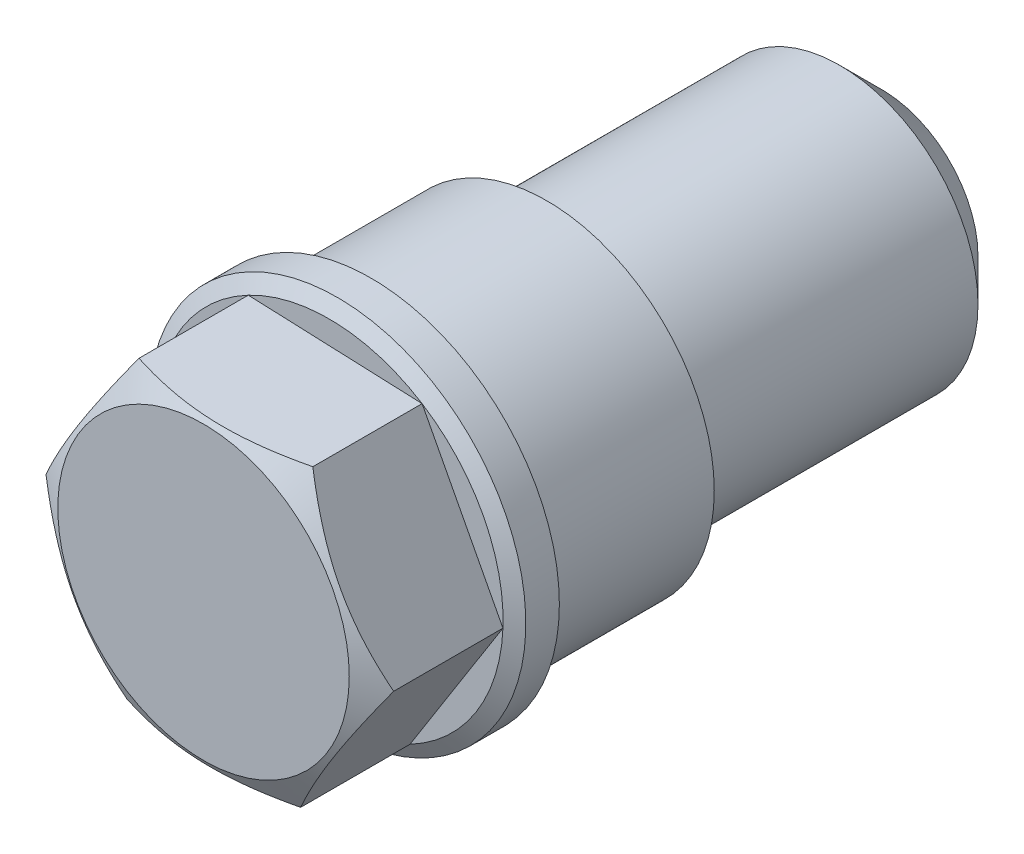
ISO-10303-21;
HEADER;
FILE_DESCRIPTION(('STEP AP214'),'2;1');
FILE_NAME('part.step','',(''),(''),'','','');
FILE_SCHEMA(('AUTOMOTIVE_DESIGN { 1 0 10303 214 1 1 1 1 }'));
ENDSEC;
DATA;
#1=APPLICATION_CONTEXT('core data for automotive mechanical design processes');
#2=APPLICATION_PROTOCOL_DEFINITION('international standard','automotive_design',2000,#1);
#3=PRODUCT_CONTEXT('',#1,'mechanical');
#4=PRODUCT('Part','Part','',(#3));
#5=PRODUCT_RELATED_PRODUCT_CATEGORY('part','',(#4));
#6=PRODUCT_DEFINITION_FORMATION('','',#4);
#7=PRODUCT_DEFINITION_CONTEXT('part definition',#1,'design');
#8=PRODUCT_DEFINITION('design','',#6,#7);
#9=PRODUCT_DEFINITION_SHAPE('','',#8);
#10=(LENGTH_UNIT() NAMED_UNIT(*) SI_UNIT(.MILLI.,.METRE.));
#11=(NAMED_UNIT(*) PLANE_ANGLE_UNIT() SI_UNIT($,.RADIAN.));
#12=(NAMED_UNIT(*) SI_UNIT($,.STERADIAN.) SOLID_ANGLE_UNIT());
#13=UNCERTAINTY_MEASURE_WITH_UNIT(LENGTH_MEASURE(1.E-05),#10,'distance_accuracy_value','');
#14=(GEOMETRIC_REPRESENTATION_CONTEXT(3) GLOBAL_UNCERTAINTY_ASSIGNED_CONTEXT((#13)) GLOBAL_UNIT_ASSIGNED_CONTEXT((#10,
#11,#12)) REPRESENTATION_CONTEXT('',''));
#15=CARTESIAN_POINT('',(0.,0.,0.));
#16=DIRECTION('',(0.,0.,1.));
#17=DIRECTION('',(1.,0.,0.));
#18=AXIS2_PLACEMENT_3D('',#15,#16,#17);
#19=CARTESIAN_POINT('',(-1.93101930562752,3.67967126065155,16.2));
#20=DIRECTION('',(0.845164899322667,-0.534505652872732,0.));
#21=DIRECTION('',(0.534505652872732,0.845164899322667,0.));
#22=AXIS2_PLACEMENT_3D('',#19,#20,#21);
#23=PLANE('',#22);
#24=CARTESIAN_POINT('',(-1.93089282009711,3.67987126065155,15.8105225637109));
#25=CARTESIAN_POINT('',(-2.02850232577983,3.52553027735251,15.8632591209234));
#26=CARTESIAN_POINT('',(-2.12695439061747,3.36985703232806,15.9112211166116));
#27=CARTESIAN_POINT('',(-2.32556332593779,3.05581488904591,15.994939306388));
#28=CARTESIAN_POINT('',(-2.42572372545706,2.89744041064543,16.0306658839842));
#29=CARTESIAN_POINT('',(-2.62480322277564,2.58265421071628,16.0862795686884));
#30=CARTESIAN_POINT('',(-2.72369168953103,2.42629092325561,16.1065368132222));
#31=CARTESIAN_POINT('',(-2.92193393408525,2.11282859454182,16.1307198650165));
#32=CARTESIAN_POINT('',(-3.02128699131302,1.95573069266181,16.1346656978121));
#33=CARTESIAN_POINT('',(-3.20693419191941,1.66218375491334,16.1264575898091));
#34=CARTESIAN_POINT('',(-3.29325612405091,1.52569077923171,16.1163190181107));
#35=CARTESIAN_POINT('',(-3.46533760072212,1.25359407992749,16.0841855129931));
#36=CARTESIAN_POINT('',(-3.55109655005232,1.11799129745525,16.0621796023997));
#37=CARTESIAN_POINT('',(-3.72353283458237,0.845333572937014,16.007166455926));
#38=CARTESIAN_POINT('',(-3.81018834488149,0.708313140610283,15.9739260178288));
#39=CARTESIAN_POINT('',(-3.98220690796934,0.436315920800911,15.8984832671009));
#40=CARTESIAN_POINT('',(-4.06757216462375,0.301335648547065,15.85629868128));
#41=CARTESIAN_POINT('',(-4.15232492764392,0.167323856454169,15.8105225637109));
#42=B_SPLINE_CURVE_WITH_KNOTS('',3,(#24,#25,#26,#27,#28,#29,#30,#31,#32,#33,#34,#35,#36,#37,#38,
#39,#40,#41),.UNSPECIFIED.,.F.,.F.,(4,2,2,2,2,2,2,2,4),(0.,0.570460334434682,1.14229189781938,
1.69997082129559,2.25696487814101,2.74195302123139,3.22739054508561,3.72359597787217,
4.21882700126054),.UNSPECIFIED.);
#43=CARTESIAN_POINT('',(-1.93101930562752,3.67967126065155,15.8105908787731));
#44=VERTEX_POINT('',#43);
#45=CARTESIAN_POINT('',(-4.15219844211351,0.167523856454169,15.8105908787731));
#46=VERTEX_POINT('',#45);
#47=EDGE_CURVE('E105',#44,#46,#42,.T.);
#48=ORIENTED_EDGE('',*,*,#47,.F.);
#49=DIRECTION('',(0.,0.,-1.));
#50=VECTOR('',#49,1.);
#51=CARTESIAN_POINT('',(-1.93101930562752,3.67967126065155,16.2));
#52=LINE('',#51,#50);
#53=CARTESIAN_POINT('',(-1.93101930562749,3.67967126065155,13.2));
#54=VERTEX_POINT('',#53);
#55=EDGE_CURVE('E116',#44,#54,#52,.T.);
#56=ORIENTED_EDGE('',*,*,#55,.T.);
#57=DIRECTION('',(-0.534505652872732,-0.845164899322668,0.));
#58=VECTOR('',#57,1.);
#59=CARTESIAN_POINT('',(-1.93101930562752,3.67967126065155,13.2));
#60=LINE('',#59,#58);
#61=CARTESIAN_POINT('',(-4.1521984421135,0.167523856454147,13.2));
#62=VERTEX_POINT('',#61);
#63=EDGE_CURVE('E120',#54,#62,#60,.T.);
#64=ORIENTED_EDGE('',*,*,#63,.T.);
#65=DIRECTION('',(0.,0.,-1.));
#66=VECTOR('',#65,1.);
#67=CARTESIAN_POINT('',(-4.15219844211351,0.167523856454169,16.2));
#68=LINE('',#67,#66);
#69=EDGE_CURVE('E118',#46,#62,#68,.T.);
#70=ORIENTED_EDGE('',*,*,#69,.F.);
#71=EDGE_LOOP('',(#48,#56,#64,#70));
#72=FACE_BOUND('',#71,.T.);
#73=ADVANCED_FACE('F49',(#72),#23,.F.);
#74=CARTESIAN_POINT('',(-4.15219844211351,0.167523856454169,16.2));
#75=DIRECTION('',(0.885477923515507,0.464681446763981,0.));
#76=DIRECTION('',(-0.464681446763981,0.885477923515507,0.));
#77=AXIS2_PLACEMENT_3D('',#74,#75,#76);
#78=PLANE('',#77);
#79=CARTESIAN_POINT('',(-4.15230339819077,0.167723856454169,15.8105256740075));
#80=CARTESIAN_POINT('',(-4.06744502313959,0.00602121423229818,15.8632619757784));
#81=CARTESIAN_POINT('',(-3.98185415570975,-0.157077235450731,15.911223700143));
#82=CARTESIAN_POINT('',(-3.80919032785132,-0.486098350502845,15.994941326789));
#83=CARTESIAN_POINT('',(-3.72211429944983,-0.652026862075416,16.0306676129326));
#84=CARTESIAN_POINT('',(-3.54904138540371,-0.981827515003518,16.0862807214572));
#85=CARTESIAN_POINT('',(-3.46307112899822,-1.14564891277215,16.1065376795063));
#86=CARTESIAN_POINT('',(-3.29072610058421,-1.47406253666656,16.1307201775791));
#87=CARTESIAN_POINT('',(-3.20435195499539,-1.63865356911263,16.1346657429036));
#88=CARTESIAN_POINT('',(-3.04295729614008,-1.94620061749366,16.1264572121524));
#89=CARTESIAN_POINT('',(-2.96791262164806,-2.08920267406994,16.116318588679));
#90=CARTESIAN_POINT('',(-2.81831218777392,-2.37427513062356,16.0841852237419));
#91=CARTESIAN_POINT('',(-2.74375694582343,-2.51634454460437,16.0621795056608));
#92=CARTESIAN_POINT('',(-2.59384806887124,-2.80200475764832,16.0071669601546));
#93=CARTESIAN_POINT('',(-2.51851340705733,-2.94555940218226,15.9739269382455));
#94=CARTESIAN_POINT('',(-2.36896767729362,-3.23052761682467,15.8984851780359));
#95=CARTESIAN_POINT('',(-2.29475469346699,-3.37194483774951,15.8563011657596));
#96=CARTESIAN_POINT('',(-2.22107418040873,-3.5123474041974,15.8105256740075));
#97=B_SPLINE_CURVE_WITH_KNOTS('',3,(#79,#80,#81,#82,#83,#84,#85,#86,#87,#88,#89,#90,#91,#92,#93,
#94,#95,#96),.UNSPECIFIED.,.F.,.F.,(4,2,2,2,2,2,2,2,4),(0.,0.570459596737105,1.14229040222241,
1.69996865848821,2.25696205617403,2.74194543162138,3.22737816985609,3.72357856377549,
4.21880458403556),.UNSPECIFIED.);
#98=CARTESIAN_POINT('',(-2.22117913648599,-3.5121474041974,15.8105908787731));
#99=VERTEX_POINT('',#98);
#100=EDGE_CURVE('E121',#46,#99,#97,.T.);
#101=ORIENTED_EDGE('',*,*,#100,.F.);
#102=ORIENTED_EDGE('',*,*,#69,.T.);
#103=DIRECTION('',(0.464681446763981,-0.885477923515507,0.));
#104=VECTOR('',#103,1.);
#105=CARTESIAN_POINT('',(-4.15219844211351,0.167523856454169,13.2));
#106=LINE('',#105,#104);
#107=CARTESIAN_POINT('',(-2.22117913648599,-3.5121474041974,13.2));
#108=VERTEX_POINT('',#107);
#109=EDGE_CURVE('E305',#62,#108,#106,.T.);
#110=ORIENTED_EDGE('',*,*,#109,.T.);
#111=DIRECTION('',(0.,0.,-1.));
#112=VECTOR('',#111,1.);
#113=CARTESIAN_POINT('',(-2.22117913648599,-3.5121474041974,16.2));
#114=LINE('',#113,#112);
#115=EDGE_CURVE('E142',#99,#108,#114,.T.);
#116=ORIENTED_EDGE('',*,*,#115,.F.);
#117=EDGE_LOOP('',(#101,#102,#110,#116));
#118=FACE_BOUND('',#117,.T.);
#119=ADVANCED_FACE('F190',(#118),#78,.F.);
#120=CARTESIAN_POINT('',(-2.22117913648599,-3.5121474041974,16.2));
#121=DIRECTION('',(0.0403130241928374,0.999187099636713,0.));
#122=DIRECTION('',(-0.999187099636714,0.0403130241928374,0.));
#123=AXIS2_PLACEMENT_3D('',#120,#121,#122);
#124=PLANE('',#123);
#125=CARTESIAN_POINT('',(-2.22137913648599,-3.51213933503313,15.8105330946878));
#126=CARTESIAN_POINT('',(-2.03891178638402,-3.51950113013811,15.8632687870104));
#127=CARTESIAN_POINT('',(-1.85486938815632,-3.52692647185335,15.9112298640344));
#128=CARTESIAN_POINT('',(-1.4835977455532,-3.5419057312091,15.9949461471296));
#129=CARTESIAN_POINT('',(-1.29636190450857,-3.54945991499764,16.0306717379078));
#130=CARTESIAN_POINT('',(-0.924210643686706,-3.56447466327287,16.0862834717494));
#131=CARTESIAN_POINT('',(-0.739352481854852,-3.57193291764073,16.1065397462866));
#132=CARTESIAN_POINT('',(-0.368766396550503,-3.58688451762419,16.1307209232598));
#133=CARTESIAN_POINT('',(-0.183039819937954,-3.59437780889963,16.1346658504376));
#134=CARTESIAN_POINT('',(0.16399672538397,-3.60837928335066,16.1264563110873));
#135=CARTESIAN_POINT('',(0.325358660449357,-3.61488956315156,16.1163175640984));
#136=CARTESIAN_POINT('',(0.647031265359129,-3.62786770859461,16.0841845336266));
#137=CARTESIAN_POINT('',(0.807340822711377,-3.63433552935234,16.0621792748549));
#138=CARTESIAN_POINT('',(1.12967658385126,-3.64734043037816,16.0071681631682));
#139=CARTESIAN_POINT('',(1.29166199366656,-3.65387586477993,15.9739291342184));
#140=CARTESIAN_POINT('',(1.61321692352927,-3.66684926252655,15.8984897372289));
#141=CARTESIAN_POINT('',(1.77279056274948,-3.67328739206281,15.8563070933387));
#142=CARTESIAN_POINT('',(1.93121930562752,-3.67967932981582,15.8105330946878));
#143=B_SPLINE_CURVE_WITH_KNOTS('',3,(#125,#126,#127,#128,#129,#130,#131,#132,#133,#134,#135,
#136,#137,#138,#139,#140,#141,#142),.UNSPECIFIED.,.F.,.F.,(4,2,2,2,2,2,2,2,4),(0.,
0.570457836705604,1.14228683396105,1.69996349836757,2.25695532340196,2.7419273239141,
3.22734864432597,3.7235370162227,4.21875109972475),.UNSPECIFIED.);
#144=CARTESIAN_POINT('',(1.93101930562752,-3.67967126065155,15.8105908787731));
#145=VERTEX_POINT('',#144);
#146=EDGE_CURVE('E246',#99,#145,#143,.T.);
#147=ORIENTED_EDGE('',*,*,#146,.F.);
#148=ORIENTED_EDGE('',*,*,#115,.T.);
#149=DIRECTION('',(0.999187099636713,-0.0403130241928374,0.));
#150=VECTOR('',#149,1.);
#151=CARTESIAN_POINT('',(-2.22117913648599,-3.5121474041974,13.2));
#152=LINE('',#151,#150);
#153=CARTESIAN_POINT('',(1.93101930562749,-3.67967126065155,13.2));
#154=VERTEX_POINT('',#153);
#155=EDGE_CURVE('E298',#108,#154,#152,.T.);
#156=ORIENTED_EDGE('',*,*,#155,.T.);
#157=DIRECTION('',(0.,0.,-1.));
#158=VECTOR('',#157,1.);
#159=CARTESIAN_POINT('',(1.93101930562752,-3.67967126065155,16.2));
#160=LINE('',#159,#158);
#161=EDGE_CURVE('E139',#145,#154,#160,.T.);
#162=ORIENTED_EDGE('',*,*,#161,.F.);
#163=EDGE_LOOP('',(#147,#148,#156,#162));
#164=FACE_BOUND('',#163,.T.);
#165=ADVANCED_FACE('F196',(#164),#124,.F.);
#166=CARTESIAN_POINT('',(1.93101930562752,-3.67967126065155,16.2));
#167=DIRECTION('',(-0.845164899322668,0.53450565287273,0.));
#168=DIRECTION('',(-0.53450565287273,-0.845164899322668,0.));
#169=AXIS2_PLACEMENT_3D('',#166,#167,#168);
#170=PLANE('',#169);
#171=CARTESIAN_POINT('',(1.93089282009711,-3.67987126065155,15.8105225637109));
#172=CARTESIAN_POINT('',(2.02850232577983,-3.52553027735251,15.8632591209234));
#173=CARTESIAN_POINT('',(2.12695439061747,-3.36985703232806,15.9112211166116));
#174=CARTESIAN_POINT('',(2.32556332593778,-3.05581488904591,15.994939306388));
#175=CARTESIAN_POINT('',(2.42572372545706,-2.89744041064543,16.0306658839842));
#176=CARTESIAN_POINT('',(2.62480322277563,-2.58265421071628,16.0862795686884));
#177=CARTESIAN_POINT('',(2.72369168953102,-2.42629092325561,16.1065368132222));
#178=CARTESIAN_POINT('',(2.92193393408525,-2.11282859454181,16.1307198650165));
#179=CARTESIAN_POINT('',(3.02128699131302,-1.95573069266181,16.1346656978121));
#180=CARTESIAN_POINT('',(3.20693419191941,-1.66218375491334,16.1264575898091));
#181=CARTESIAN_POINT('',(3.29325612405091,-1.5256907792317,16.1163190181107));
#182=CARTESIAN_POINT('',(3.46533760072212,-1.25359407992748,16.0841855129931));
#183=CARTESIAN_POINT('',(3.55109655005232,-1.11799129745525,16.0621796023997));
#184=CARTESIAN_POINT('',(3.72353283458237,-0.845333572937006,16.007166455926));
#185=CARTESIAN_POINT('',(3.81018834488149,-0.708313140610274,15.9739260178288));
#186=CARTESIAN_POINT('',(3.98220690796934,-0.436315920800899,15.8984832671009));
#187=CARTESIAN_POINT('',(4.06757216462375,-0.301335648547051,15.85629868128));
#188=CARTESIAN_POINT('',(4.15232492764392,-0.167323856454155,15.8105225637109));
#189=B_SPLINE_CURVE_WITH_KNOTS('',3,(#171,#172,#173,#174,#175,#176,#177,#178,#179,#180,#181,
#182,#183,#184,#185,#186,#187,#188),.UNSPECIFIED.,.F.,.F.,(4,2,2,2,2,2,2,2,4),(0.,
0.570460334434681,1.14229189781938,1.69997082129559,2.25696487814101,2.7419530212314,
3.22739054508562,3.72359597787218,4.21882700126055),.UNSPECIFIED.);
#190=CARTESIAN_POINT('',(4.15219844211351,-0.167523856454155,15.8105908787731));
#191=VERTEX_POINT('',#190);
#192=EDGE_CURVE('E240',#145,#191,#189,.T.);
#193=ORIENTED_EDGE('',*,*,#192,.F.);
#194=ORIENTED_EDGE('',*,*,#161,.T.);
#195=DIRECTION('',(0.53450565287273,0.845164899322668,0.));
#196=VECTOR('',#195,1.);
#197=CARTESIAN_POINT('',(1.93101930562752,-3.67967126065155,13.2));
#198=LINE('',#197,#196);
#199=CARTESIAN_POINT('',(4.1521984421135,-0.167523856454177,13.2));
#200=VERTEX_POINT('',#199);
#201=EDGE_CURVE('E304',#154,#200,#198,.T.);
#202=ORIENTED_EDGE('',*,*,#201,.T.);
#203=DIRECTION('',(0.,0.,-1.));
#204=VECTOR('',#203,1.);
#205=CARTESIAN_POINT('',(4.15219844211351,-0.167523856454155,16.2));
#206=LINE('',#205,#204);
#207=EDGE_CURVE('E73',#191,#200,#206,.T.);
#208=ORIENTED_EDGE('',*,*,#207,.F.);
#209=EDGE_LOOP('',(#193,#194,#202,#208));
#210=FACE_BOUND('',#209,.T.);
#211=ADVANCED_FACE('F254',(#210),#170,.F.);
#212=CARTESIAN_POINT('',(4.15219844211351,-0.167523856454155,16.2));
#213=DIRECTION('',(-0.885477923515506,-0.464681446763983,0.));
#214=DIRECTION('',(0.464681446763983,-0.885477923515506,0.));
#215=AXIS2_PLACEMENT_3D('',#212,#213,#214);
#216=PLANE('',#215);
#217=CARTESIAN_POINT('',(4.15230339819077,-0.167723856454155,15.8105256740075));
#218=CARTESIAN_POINT('',(4.0674450231396,-0.00602121423228384,15.8632619757784));
#219=CARTESIAN_POINT('',(3.98185415570975,0.157077235450746,15.911223700143));
#220=CARTESIAN_POINT('',(3.80919032785132,0.48609835050286,15.994941326789));
#221=CARTESIAN_POINT('',(3.72211429944982,0.652026862075431,16.0306676129326));
#222=CARTESIAN_POINT('',(3.5490413854037,0.981827515003532,16.0862807214572));
#223=CARTESIAN_POINT('',(3.46307112899822,1.14564891277217,16.1065376795063));
#224=CARTESIAN_POINT('',(3.29072610058421,1.47406253666658,16.1307201775791));
#225=CARTESIAN_POINT('',(3.20435195499539,1.63865356911264,16.1346657429036));
#226=CARTESIAN_POINT('',(3.04295729614008,1.94620061749368,16.1264572121524));
#227=CARTESIAN_POINT('',(2.96791262164806,2.08920267406996,16.116318588679));
#228=CARTESIAN_POINT('',(2.81831218777392,2.37427513062356,16.0841852237419));
#229=CARTESIAN_POINT('',(2.74375694582343,2.51634454460438,16.0621795056608));
#230=CARTESIAN_POINT('',(2.59384806887124,2.80200475764832,16.0071669601546));
#231=CARTESIAN_POINT('',(2.51851340705733,2.94555940218227,15.9739269382455));
#232=CARTESIAN_POINT('',(2.36896767729362,3.23052761682467,15.8984851780359));
#233=CARTESIAN_POINT('',(2.29475469346699,3.37194483774951,15.8563011657596));
#234=CARTESIAN_POINT('',(2.22107418040873,3.5123474041974,15.8105256740075));
#235=B_SPLINE_CURVE_WITH_KNOTS('',3,(#217,#218,#219,#220,#221,#222,#223,#224,#225,#226,#227,
#228,#229,#230,#231,#232,#233,#234),.UNSPECIFIED.,.F.,.F.,(4,2,2,2,2,2,2,2,4),(0.,
0.570459596737104,1.14229040222241,1.69996865848821,2.25696205617403,2.74194543162137,
3.22737816985608,3.72357856377548,4.21880458403554),.UNSPECIFIED.);
#236=CARTESIAN_POINT('',(2.22117913648599,3.5121474041974,15.8105908787731));
#237=VERTEX_POINT('',#236);
#238=EDGE_CURVE('E66',#191,#237,#235,.T.);
#239=ORIENTED_EDGE('',*,*,#238,.F.);
#240=ORIENTED_EDGE('',*,*,#207,.T.);
#241=DIRECTION('',(-0.464681446763983,0.885477923515506,0.));
#242=VECTOR('',#241,1.);
#243=CARTESIAN_POINT('',(4.15219844211351,-0.167523856454155,13.2));
#244=LINE('',#243,#242);
#245=CARTESIAN_POINT('',(2.22117913648601,3.51214740419737,13.2));
#246=VERTEX_POINT('',#245);
#247=EDGE_CURVE('E133',#200,#246,#244,.T.);
#248=ORIENTED_EDGE('',*,*,#247,.T.);
#249=DIRECTION('',(0.,0.,-1.));
#250=VECTOR('',#249,1.);
#251=CARTESIAN_POINT('',(2.22117913648599,3.5121474041974,16.2));
#252=LINE('',#251,#250);
#253=EDGE_CURVE('E128',#237,#246,#252,.T.);
#254=ORIENTED_EDGE('',*,*,#253,.F.);
#255=EDGE_LOOP('',(#239,#240,#248,#254));
#256=FACE_BOUND('',#255,.T.);
#257=ADVANCED_FACE('F258',(#256),#216,.F.);
#258=CARTESIAN_POINT('',(2.22117913648599,3.5121474041974,16.2));
#259=DIRECTION('',(-0.0403130241928373,-0.999187099636713,0.));
#260=DIRECTION('',(0.999187099636714,-0.0403130241928373,0.));
#261=AXIS2_PLACEMENT_3D('',#258,#259,#260);
#262=PLANE('',#261);
#263=CARTESIAN_POINT('',(2.22137913648599,3.51213933503313,15.8105330946878));
#264=CARTESIAN_POINT('',(2.03891178638402,3.51950113013811,15.8632687870104));
#265=CARTESIAN_POINT('',(1.85486938815632,3.52692647185335,15.9112298640344));
#266=CARTESIAN_POINT('',(1.4835977455532,3.5419057312091,15.9949461471296));
#267=CARTESIAN_POINT('',(1.29636190450857,3.54945991499764,16.0306717379078));
#268=CARTESIAN_POINT('',(0.924210643686706,3.56447466327287,16.0862834717494));
#269=CARTESIAN_POINT('',(0.739352481854851,3.57193291764073,16.1065397462866));
#270=CARTESIAN_POINT('',(0.368766396550502,3.58688451762419,16.1307209232598));
#271=CARTESIAN_POINT('',(0.183039819937953,3.59437780889963,16.1346658504376));
#272=CARTESIAN_POINT('',(-0.163996725383971,3.60837928335066,16.1264563110873));
#273=CARTESIAN_POINT('',(-0.325358660449359,3.61488956315156,16.1163175640984));
#274=CARTESIAN_POINT('',(-0.64703126535913,3.62786770859461,16.0841845336266));
#275=CARTESIAN_POINT('',(-0.807340822711378,3.63433552935234,16.0621792748549));
#276=CARTESIAN_POINT('',(-1.12967658385126,3.64734043037816,16.0071681631682));
#277=CARTESIAN_POINT('',(-1.29166199366656,3.65387586477993,15.9739291342184));
#278=CARTESIAN_POINT('',(-1.61321692352927,3.66684926252655,15.8984897372289));
#279=CARTESIAN_POINT('',(-1.77279056274948,3.67328739206281,15.8563070933387));
#280=CARTESIAN_POINT('',(-1.93121930562752,3.67967932981582,15.8105330946878));
#281=B_SPLINE_CURVE_WITH_KNOTS('',3,(#263,#264,#265,#266,#267,#268,#269,#270,#271,#272,#273,
#274,#275,#276,#277,#278,#279,#280),.UNSPECIFIED.,.F.,.F.,(4,2,2,2,2,2,2,2,4),(0.,
0.570457836705604,1.14228683396105,1.69996349836757,2.25695532340196,2.7419273239141,
3.22734864432597,3.7235370162227,4.21875109972475),.UNSPECIFIED.);
#282=EDGE_CURVE('E102',#237,#44,#281,.T.);
#283=ORIENTED_EDGE('',*,*,#282,.F.);
#284=ORIENTED_EDGE('',*,*,#253,.T.);
#285=DIRECTION('',(-0.999187099636714,0.0403130241928373,0.));
#286=VECTOR('',#285,1.);
#287=CARTESIAN_POINT('',(2.22117913648599,3.5121474041974,13.2));
#288=LINE('',#287,#286);
#289=EDGE_CURVE('E126',#246,#54,#288,.T.);
#290=ORIENTED_EDGE('',*,*,#289,.T.);
#291=ORIENTED_EDGE('',*,*,#55,.F.);
#292=EDGE_LOOP('',(#283,#284,#290,#291));
#293=FACE_BOUND('',#292,.T.);
#294=ADVANCED_FACE('F124',(#293),#262,.F.);
#295=CARTESIAN_POINT('',(0.,0.,13.2));
#296=DIRECTION('',(0.,0.,1.));
#297=DIRECTION('',(1.,0.,0.));
#298=AXIS2_PLACEMENT_3D('',#295,#296,#297);
#299=PLANE('',#298);
#300=ORIENTED_EDGE('',*,*,#63,.F.);
#301=CARTESIAN_POINT('',(0.,0.,13.2));
#302=DIRECTION('',(0.,0.,1.));
#303=DIRECTION('',(1.,0.,0.));
#304=AXIS2_PLACEMENT_3D('',#301,#302,#303);
#305=CIRCLE('',#304,4.15557651176958);
#306=EDGE_CURVE('E153',#54,#62,#305,.T.);
#307=ORIENTED_EDGE('',*,*,#306,.T.);
#308=EDGE_LOOP('',(#300,#307));
#309=FACE_BOUND('',#308,.T.);
#310=ADVANCED_FACE('F264',(#309),#299,.T.);
#311=ORIENTED_EDGE('',*,*,#289,.F.);
#312=EDGE_CURVE('E148',#246,#54,#305,.T.);
#313=ORIENTED_EDGE('',*,*,#312,.T.);
#314=EDGE_LOOP('',(#311,#313));
#315=FACE_BOUND('',#314,.T.);
#316=ADVANCED_FACE('F268',(#315),#299,.T.);
#317=ORIENTED_EDGE('',*,*,#247,.F.);
#318=EDGE_CURVE('E147',#200,#246,#305,.T.);
#319=ORIENTED_EDGE('',*,*,#318,.T.);
#320=EDGE_LOOP('',(#317,#319));
#321=FACE_BOUND('',#320,.T.);
#322=ADVANCED_FACE('F274',(#321),#299,.T.);
#323=ORIENTED_EDGE('',*,*,#201,.F.);
#324=EDGE_CURVE('E323',#154,#200,#305,.T.);
#325=ORIENTED_EDGE('',*,*,#324,.T.);
#326=EDGE_LOOP('',(#323,#325));
#327=FACE_BOUND('',#326,.T.);
#328=ADVANCED_FACE('F287',(#327),#299,.T.);
#329=ORIENTED_EDGE('',*,*,#155,.F.);
#330=EDGE_CURVE('E301',#108,#154,#305,.T.);
#331=ORIENTED_EDGE('',*,*,#330,.T.);
#332=EDGE_LOOP('',(#329,#331));
#333=FACE_BOUND('',#332,.T.);
#334=ADVANCED_FACE('F278',(#333),#299,.T.);
#335=CARTESIAN_POINT('',(0.,0.,13.2));
#336=DIRECTION('',(0.,0.,-1.));
#337=DIRECTION('',(-1.,0.,0.));
#338=AXIS2_PLACEMENT_3D('',#335,#336,#337);
#339=CYLINDRICAL_SURFACE('',#338,4.5);
#340=CARTESIAN_POINT('',(0.,0.,12.2));
#341=DIRECTION('',(0.,0.,1.));
#342=DIRECTION('',(1.,0.,0.));
#343=AXIS2_PLACEMENT_3D('',#340,#341,#342);
#344=CIRCLE('',#343,4.5);
#345=CARTESIAN_POINT('',(4.5,0.,12.2));
#346=VERTEX_POINT('',#345);
#347=EDGE_CURVE('E157',#346,#346,#344,.T.);
#348=ORIENTED_EDGE('',*,*,#347,.T.);
#349=EDGE_LOOP('',(#348));
#350=FACE_BOUND('',#349,.T.);
#351=CARTESIAN_POINT('',(0.,0.,13.0011470063549));
#352=DIRECTION('',(0.,0.,-1.));
#353=DIRECTION('',(-1.,0.,0.));
#354=AXIS2_PLACEMENT_3D('',#351,#352,#353);
#355=CIRCLE('',#354,4.5);
#356=CARTESIAN_POINT('',(-4.5,0.,13.0011470063549));
#357=VERTEX_POINT('',#356);
#358=EDGE_CURVE('E152',#357,#357,#355,.F.);
#359=ORIENTED_EDGE('',*,*,#358,.F.);
#360=EDGE_LOOP('',(#359));
#361=FACE_BOUND('',#360,.T.);
#362=ADVANCED_FACE('F286',(#350,#361),#339,.T.);
#363=CARTESIAN_POINT('',(0.,0.,8.));
#364=DIRECTION('',(0.,0.,-1.));
#365=DIRECTION('',(-1.,0.,0.));
#366=AXIS2_PLACEMENT_3D('',#363,#364,#365);
#367=CYLINDRICAL_SURFACE('',#366,3.3);
#368=CARTESIAN_POINT('',(0.,0.,0.999999999999999));
#369=DIRECTION('',(0.,0.,1.));
#370=DIRECTION('',(1.,0.,0.));
#371=AXIS2_PLACEMENT_3D('',#368,#369,#370);
#372=CIRCLE('',#371,3.3);
#373=CARTESIAN_POINT('',(3.3,0.,0.999999999999999));
#374=VERTEX_POINT('',#373);
#375=EDGE_CURVE('E59',#374,#374,#372,.T.);
#376=ORIENTED_EDGE('',*,*,#375,.T.);
#377=EDGE_LOOP('',(#376));
#378=FACE_BOUND('',#377,.T.);
#379=CARTESIAN_POINT('',(0.,0.,8.));
#380=DIRECTION('',(0.,0.,1.));
#381=DIRECTION('',(1.,0.,0.));
#382=AXIS2_PLACEMENT_3D('',#379,#380,#381);
#383=CIRCLE('',#382,3.3);
#384=CARTESIAN_POINT('',(3.3,0.,8.));
#385=VERTEX_POINT('',#384);
#386=EDGE_CURVE('E166',#385,#385,#383,.T.);
#387=ORIENTED_EDGE('',*,*,#386,.F.);
#388=EDGE_LOOP('',(#387));
#389=FACE_BOUND('',#388,.T.);
#390=ADVANCED_FACE('F176',(#378,#389),#367,.T.);
#391=CARTESIAN_POINT('',(0.,0.,0.));
#392=DIRECTION('',(0.,0.,1.));
#393=DIRECTION('',(1.,0.,0.));
#394=AXIS2_PLACEMENT_3D('',#391,#392,#393);
#395=PLANE('',#394);
#396=CARTESIAN_POINT('',(0.,0.,0.));
#397=DIRECTION('',(0.,0.,1.));
#398=DIRECTION('',(1.,0.,0.));
#399=AXIS2_PLACEMENT_3D('',#396,#397,#398);
#400=CIRCLE('',#399,2.3);
#401=CARTESIAN_POINT('',(2.3,0.,0.));
#402=VERTEX_POINT('',#401);
#403=EDGE_CURVE('E12',#402,#402,#400,.F.);
#404=ORIENTED_EDGE('',*,*,#403,.T.);
#405=EDGE_LOOP('',(#404));
#406=FACE_BOUND('',#405,.T.);
#407=ADVANCED_FACE('F420',(#406),#395,.F.);
#408=CARTESIAN_POINT('',(0.,0.,12.2));
#409=DIRECTION('',(0.,0.,-1.));
#410=DIRECTION('',(-1.,0.,0.));
#411=AXIS2_PLACEMENT_3D('',#408,#409,#410);
#412=CYLINDRICAL_SURFACE('',#411,4.);
#413=CARTESIAN_POINT('',(0.,0.,12.2));
#414=DIRECTION('',(0.,0.,1.));
#415=DIRECTION('',(1.,0.,0.));
#416=AXIS2_PLACEMENT_3D('',#413,#414,#415);
#417=CIRCLE('',#416,4.);
#418=CARTESIAN_POINT('',(4.,0.,12.2));
#419=VERTEX_POINT('',#418);
#420=EDGE_CURVE('E162',#419,#419,#417,.T.);
#421=ORIENTED_EDGE('',*,*,#420,.F.);
#422=EDGE_LOOP('',(#421));
#423=FACE_BOUND('',#422,.T.);
#424=CARTESIAN_POINT('',(0.,0.,8.));
#425=DIRECTION('',(0.,0.,1.));
#426=DIRECTION('',(1.,0.,0.));
#427=AXIS2_PLACEMENT_3D('',#424,#425,#426);
#428=CIRCLE('',#427,4.);
#429=CARTESIAN_POINT('',(4.,0.,8.));
#430=VERTEX_POINT('',#429);
#431=EDGE_CURVE('E161',#430,#430,#428,.T.);
#432=ORIENTED_EDGE('',*,*,#431,.T.);
#433=EDGE_LOOP('',(#432));
#434=FACE_BOUND('',#433,.T.);
#435=ADVANCED_FACE('F426',(#423,#434),#412,.T.);
#436=CARTESIAN_POINT('',(0.,0.,8.));
#437=DIRECTION('',(0.,0.,1.));
#438=DIRECTION('',(1.,0.,0.));
#439=AXIS2_PLACEMENT_3D('',#436,#437,#438);
#440=PLANE('',#439);
#441=ORIENTED_EDGE('',*,*,#386,.T.);
#442=EDGE_LOOP('',(#441));
#443=FACE_BOUND('',#442,.T.);
#444=ORIENTED_EDGE('',*,*,#431,.F.);
#445=EDGE_LOOP('',(#444));
#446=FACE_BOUND('',#445,.T.);
#447=ADVANCED_FACE('F439',(#443,#446),#440,.F.);
#448=CARTESIAN_POINT('',(0.,0.,12.2));
#449=DIRECTION('',(0.,0.,1.));
#450=DIRECTION('',(1.,0.,0.));
#451=AXIS2_PLACEMENT_3D('',#448,#449,#450);
#452=PLANE('',#451);
#453=ORIENTED_EDGE('',*,*,#420,.T.);
#454=EDGE_LOOP('',(#453));
#455=FACE_BOUND('',#454,.T.);
#456=ORIENTED_EDGE('',*,*,#347,.F.);
#457=EDGE_LOOP('',(#456));
#458=FACE_BOUND('',#457,.T.);
#459=ADVANCED_FACE('F282',(#455,#458),#452,.F.);
#460=CARTESIAN_POINT('',(0.,0.,13.2));
#461=DIRECTION('',(0.,0.,-1.));
#462=DIRECTION('',(1.,0.,0.));
#463=AXIS2_PLACEMENT_3D('',#460,#461,#462);
#464=CONICAL_SURFACE('',#463,4.15557651176958,1.0471975511966);
#465=ORIENTED_EDGE('',*,*,#312,.F.);
#466=ORIENTED_EDGE('',*,*,#318,.F.);
#467=ORIENTED_EDGE('',*,*,#324,.F.);
#468=ORIENTED_EDGE('',*,*,#330,.F.);
#469=EDGE_CURVE('E336',#62,#108,#305,.T.);
#470=ORIENTED_EDGE('',*,*,#469,.F.);
#471=ORIENTED_EDGE('',*,*,#306,.F.);
#472=EDGE_LOOP('',(#465,#466,#467,#468,#470,#471));
#473=FACE_BOUND('',#472,.T.);
#474=ORIENTED_EDGE('',*,*,#358,.T.);
#475=EDGE_LOOP('',(#474));
#476=FACE_BOUND('',#475,.T.);
#477=ADVANCED_FACE('F203',(#473,#476),#464,.T.);
#478=ORIENTED_EDGE('',*,*,#109,.F.);
#479=ORIENTED_EDGE('',*,*,#469,.T.);
#480=EDGE_LOOP('',(#478,#479));
#481=FACE_BOUND('',#480,.T.);
#482=ADVANCED_FACE('F220',(#481),#299,.T.);
#483=CARTESIAN_POINT('',(0.,0.,16.2));
#484=DIRECTION('',(0.,0.,-1.));
#485=DIRECTION('',(1.,0.,0.));
#486=AXIS2_PLACEMENT_3D('',#483,#484,#485);
#487=CONICAL_SURFACE('',#486,3.48110012887377,1.0471975511966);
#488=CARTESIAN_POINT('',(0.,0.,16.2));
#489=DIRECTION('',(0.,0.,1.));
#490=DIRECTION('',(1.,0.,0.));
#491=AXIS2_PLACEMENT_3D('',#488,#489,#490);
#492=CIRCLE('',#491,3.48110012887377);
#493=CARTESIAN_POINT('',(3.48110012887377,0.,16.2));
#494=VERTEX_POINT('',#493);
#495=EDGE_CURVE('E111',#494,#494,#492,.T.);
#496=ORIENTED_EDGE('',*,*,#495,.F.);
#497=EDGE_LOOP('',(#496));
#498=FACE_BOUND('',#497,.T.);
#499=ORIENTED_EDGE('',*,*,#47,.T.);
#500=ORIENTED_EDGE('',*,*,#100,.T.);
#501=ORIENTED_EDGE('',*,*,#146,.T.);
#502=ORIENTED_EDGE('',*,*,#192,.T.);
#503=ORIENTED_EDGE('',*,*,#238,.T.);
#504=ORIENTED_EDGE('',*,*,#282,.T.);
#505=EDGE_LOOP('',(#499,#500,#501,#502,#503,#504));
#506=FACE_BOUND('',#505,.T.);
#507=ADVANCED_FACE('F104',(#498,#506),#487,.T.);
#508=CARTESIAN_POINT('',(0.,0.,16.2));
#509=DIRECTION('',(0.,0.,1.));
#510=DIRECTION('',(1.,0.,0.));
#511=AXIS2_PLACEMENT_3D('',#508,#509,#510);
#512=PLANE('',#511);
#513=ORIENTED_EDGE('',*,*,#495,.T.);
#514=EDGE_LOOP('',(#513));
#515=FACE_BOUND('',#514,.T.);
#516=ADVANCED_FACE('F180',(#515),#512,.T.);
#517=CARTESIAN_POINT('',(0.,0.,0.999999999999999));
#518=DIRECTION('',(0.,0.,1.));
#519=DIRECTION('',(1.,0.,0.));
#520=AXIS2_PLACEMENT_3D('',#517,#518,#519);
#521=CONICAL_SURFACE('',#520,3.3,0.785398163397451);
#522=ORIENTED_EDGE('',*,*,#403,.F.);
#523=EDGE_LOOP('',(#522));
#524=FACE_BOUND('',#523,.T.);
#525=ORIENTED_EDGE('',*,*,#375,.F.);
#526=EDGE_LOOP('',(#525));
#527=FACE_BOUND('',#526,.T.);
#528=ADVANCED_FACE('F52',(#524,#527),#521,.T.);
#529=CLOSED_SHELL('',(#73,#119,#165,#211,#257,#294,#310,#316,#322,#328,#334,#362,#390,#407,#435,
#447,#459,#477,#482,#507,#516,#528));
#530=MANIFOLD_SOLID_BREP('B2',#529);
#531=ADVANCED_BREP_SHAPE_REPRESENTATION('',(#18,#530),#14);
#532=SHAPE_DEFINITION_REPRESENTATION(#9,#531);
ENDSEC;
END-ISO-10303-21;
